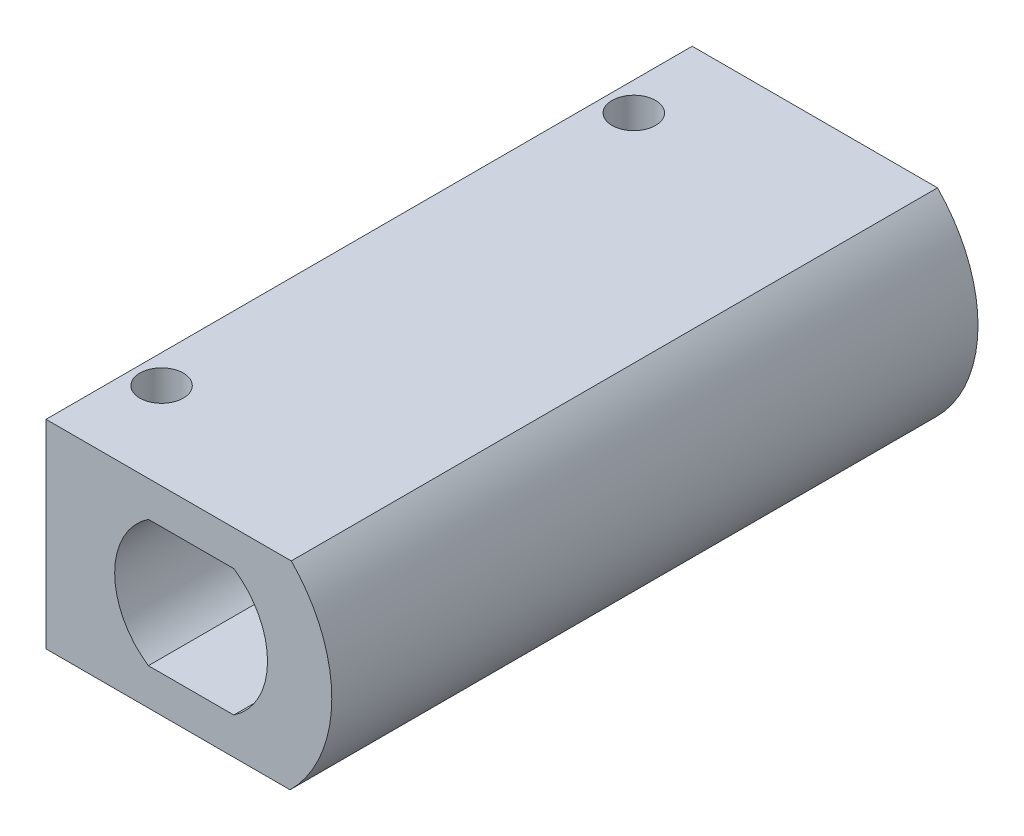
ISO-10303-21;
HEADER;
FILE_DESCRIPTION(('STEP AP214'),'2;1');
FILE_NAME('part.step','',(''),(''),'','','');
FILE_SCHEMA(('AUTOMOTIVE_DESIGN { 1 0 10303 214 1 1 1 1 }'));
ENDSEC;
DATA;
#1=APPLICATION_CONTEXT('core data for automotive mechanical design processes');
#2=APPLICATION_PROTOCOL_DEFINITION('international standard','automotive_design',2000,#1);
#3=PRODUCT_CONTEXT('',#1,'mechanical');
#4=PRODUCT('Part','Part','',(#3));
#5=PRODUCT_RELATED_PRODUCT_CATEGORY('part','',(#4));
#6=PRODUCT_DEFINITION_FORMATION('','',#4);
#7=PRODUCT_DEFINITION_CONTEXT('part definition',#1,'design');
#8=PRODUCT_DEFINITION('design','',#6,#7);
#9=PRODUCT_DEFINITION_SHAPE('','',#8);
#10=(LENGTH_UNIT() NAMED_UNIT(*) SI_UNIT(.MILLI.,.METRE.));
#11=(NAMED_UNIT(*) PLANE_ANGLE_UNIT() SI_UNIT($,.RADIAN.));
#12=(NAMED_UNIT(*) SI_UNIT($,.STERADIAN.) SOLID_ANGLE_UNIT());
#13=UNCERTAINTY_MEASURE_WITH_UNIT(LENGTH_MEASURE(1.E-05),#10,'distance_accuracy_value','');
#14=(GEOMETRIC_REPRESENTATION_CONTEXT(3) GLOBAL_UNCERTAINTY_ASSIGNED_CONTEXT((#13)) GLOBAL_UNIT_ASSIGNED_CONTEXT((#10,
#11,#12)) REPRESENTATION_CONTEXT('',''));
#15=CARTESIAN_POINT('',(0.,0.,0.));
#16=DIRECTION('',(0.,0.,1.));
#17=DIRECTION('',(1.,0.,0.));
#18=AXIS2_PLACEMENT_3D('',#15,#16,#17);
#19=CARTESIAN_POINT('',(0.,-0.291197411003233,52.));
#20=DIRECTION('',(0.,1.,0.));
#21=DIRECTION('',(-1.,0.,0.));
#22=AXIS2_PLACEMENT_3D('',#19,#20,#21);
#23=PLANE('',#22);
#24=CARTESIAN_POINT('',(-20.4679332061042,-0.291197411003231,7.));
#25=DIRECTION('',(0.,1.,0.));
#26=DIRECTION('',(-1.,0.,0.));
#27=AXIS2_PLACEMENT_3D('',#24,#25,#26);
#28=CIRCLE('',#27,1.75);
#29=CARTESIAN_POINT('',(-22.2179332061042,-0.291197411003232,7.));
#30=VERTEX_POINT('',#29);
#31=EDGE_CURVE('E277',#30,#30,#28,.T.);
#32=ORIENTED_EDGE('',*,*,#31,.T.);
#33=EDGE_LOOP('',(#32));
#34=FACE_BOUND('',#33,.T.);
#35=CARTESIAN_POINT('',(-20.4679332061042,-0.291197411003231,45.));
#36=DIRECTION('',(0.,1.,0.));
#37=DIRECTION('',(-1.,0.,0.));
#38=AXIS2_PLACEMENT_3D('',#35,#36,#37);
#39=CIRCLE('',#38,1.75);
#40=CARTESIAN_POINT('',(-22.2179332061042,-0.291197411003232,45.));
#41=VERTEX_POINT('',#40);
#42=EDGE_CURVE('E281',#41,#41,#39,.T.);
#43=ORIENTED_EDGE('',*,*,#42,.T.);
#44=EDGE_LOOP('',(#43));
#45=FACE_BOUND('',#44,.T.);
#46=DIRECTION('',(1.,0.,0.));
#47=VECTOR('',#46,1.);
#48=CARTESIAN_POINT('',(0.,-0.291197411003233,0.));
#49=LINE('',#48,#47);
#50=CARTESIAN_POINT('',(-22.7679332061042,-0.291197411003235,0.));
#51=VERTEX_POINT('',#50);
#52=CARTESIAN_POINT('',(-3.13212567747339,-0.291197411003234,0.));
#53=VERTEX_POINT('',#52);
#54=EDGE_CURVE('E285',#51,#53,#49,.T.);
#55=ORIENTED_EDGE('',*,*,#54,.T.);
#56=DIRECTION('',(0.,0.,-1.));
#57=VECTOR('',#56,1.);
#58=CARTESIAN_POINT('',(-3.13212567747339,-0.291197411003234,52.));
#59=LINE('',#58,#57);
#60=CARTESIAN_POINT('',(-3.13212567747339,-0.291197411003234,52.));
#61=VERTEX_POINT('',#60);
#62=EDGE_CURVE('E287',#61,#53,#59,.T.);
#63=ORIENTED_EDGE('',*,*,#62,.F.);
#64=DIRECTION('',(1.,0.,0.));
#65=VECTOR('',#64,1.);
#66=CARTESIAN_POINT('',(0.,-0.291197411003233,52.));
#67=LINE('',#66,#65);
#68=CARTESIAN_POINT('',(-22.7679332061042,-0.291197411003235,52.));
#69=VERTEX_POINT('',#68);
#70=EDGE_CURVE('E310',#69,#61,#67,.T.);
#71=ORIENTED_EDGE('',*,*,#70,.F.);
#72=DIRECTION('',(0.,0.,1.));
#73=VECTOR('',#72,1.);
#74=CARTESIAN_POINT('',(-22.7679332061042,-0.291197411003235,0.));
#75=LINE('',#74,#73);
#76=EDGE_CURVE('E289',#51,#69,#75,.T.);
#77=ORIENTED_EDGE('',*,*,#76,.F.);
#78=EDGE_LOOP('',(#55,#63,#71,#77));
#79=FACE_BOUND('',#78,.T.);
#80=ADVANCED_FACE('F47',(#34,#45,#79),#23,.F.);
#81=CARTESIAN_POINT('',(-11.0922513046228,7.75880258899676,52.));
#82=DIRECTION('',(0.,0.,-1.));
#83=DIRECTION('',(-1.,0.,0.));
#84=AXIS2_PLACEMENT_3D('',#81,#82,#83);
#85=CYLINDRICAL_SURFACE('',#84,11.32104677139);
#86=CARTESIAN_POINT('',(-11.0922513046228,7.75880258899676,0.));
#87=DIRECTION('',(0.,0.,1.));
#88=DIRECTION('',(1.,0.,0.));
#89=AXIS2_PLACEMENT_3D('',#86,#87,#88);
#90=CIRCLE('',#89,11.32104677139);
#91=CARTESIAN_POINT('',(-3.03225130462276,15.7088025889968,0.));
#92=VERTEX_POINT('',#91);
#93=EDGE_CURVE('E294',#53,#92,#90,.T.);
#94=ORIENTED_EDGE('',*,*,#93,.T.);
#95=DIRECTION('',(0.,0.,-1.));
#96=VECTOR('',#95,1.);
#97=CARTESIAN_POINT('',(-3.03225130462276,15.7088025889968,52.));
#98=LINE('',#97,#96);
#99=CARTESIAN_POINT('',(-3.03225130462276,15.7088025889968,52.));
#100=VERTEX_POINT('',#99);
#101=EDGE_CURVE('E311',#100,#92,#98,.T.);
#102=ORIENTED_EDGE('',*,*,#101,.F.);
#103=CARTESIAN_POINT('',(-11.0922513046228,7.75880258899676,52.));
#104=DIRECTION('',(0.,0.,1.));
#105=DIRECTION('',(1.,0.,0.));
#106=AXIS2_PLACEMENT_3D('',#103,#104,#105);
#107=CIRCLE('',#106,11.32104677139);
#108=EDGE_CURVE('E380',#61,#100,#107,.T.);
#109=ORIENTED_EDGE('',*,*,#108,.F.);
#110=ORIENTED_EDGE('',*,*,#62,.T.);
#111=EDGE_LOOP('',(#94,#102,#109,#110));
#112=FACE_BOUND('',#111,.T.);
#113=ADVANCED_FACE('F267',(#112),#85,.T.);
#114=CARTESIAN_POINT('',(0.,15.7088025889968,52.));
#115=DIRECTION('',(0.,1.,0.));
#116=DIRECTION('',(0.,0.,1.));
#117=AXIS2_PLACEMENT_3D('',#114,#115,#116);
#118=PLANE('',#117);
#119=CARTESIAN_POINT('',(-20.4679332061042,15.7088025889968,7.));
#120=DIRECTION('',(0.,1.,0.));
#121=DIRECTION('',(0.,0.,1.));
#122=AXIS2_PLACEMENT_3D('',#119,#120,#121);
#123=CIRCLE('',#122,1.75);
#124=CARTESIAN_POINT('',(-20.4679332061042,15.7088025889968,8.75));
#125=VERTEX_POINT('',#124);
#126=EDGE_CURVE('E356',#125,#125,#123,.T.);
#127=ORIENTED_EDGE('',*,*,#126,.F.);
#128=EDGE_LOOP('',(#127));
#129=FACE_BOUND('',#128,.T.);
#130=CARTESIAN_POINT('',(-20.4679332061042,15.7088025889968,45.));
#131=DIRECTION('',(0.,1.,0.));
#132=DIRECTION('',(0.,0.,1.));
#133=AXIS2_PLACEMENT_3D('',#130,#131,#132);
#134=CIRCLE('',#133,1.75);
#135=CARTESIAN_POINT('',(-20.4679332061042,15.7088025889968,46.75));
#136=VERTEX_POINT('',#135);
#137=EDGE_CURVE('E360',#136,#136,#134,.T.);
#138=ORIENTED_EDGE('',*,*,#137,.F.);
#139=EDGE_LOOP('',(#138));
#140=FACE_BOUND('',#139,.T.);
#141=DIRECTION('',(1.,0.,0.));
#142=VECTOR('',#141,1.);
#143=CARTESIAN_POINT('',(0.,15.7088025889968,0.));
#144=LINE('',#143,#142);
#145=CARTESIAN_POINT('',(-22.7679332061042,15.7088025889968,0.));
#146=VERTEX_POINT('',#145);
#147=EDGE_CURVE('E299',#146,#92,#144,.T.);
#148=ORIENTED_EDGE('',*,*,#147,.F.);
#149=DIRECTION('',(0.,0.,1.));
#150=VECTOR('',#149,1.);
#151=CARTESIAN_POINT('',(-22.7679332061042,15.7088025889968,0.));
#152=LINE('',#151,#150);
#153=CARTESIAN_POINT('',(-22.7679332061042,15.7088025889968,52.));
#154=VERTEX_POINT('',#153);
#155=EDGE_CURVE('E301',#146,#154,#152,.T.);
#156=ORIENTED_EDGE('',*,*,#155,.T.);
#157=DIRECTION('',(1.,0.,0.));
#158=VECTOR('',#157,1.);
#159=CARTESIAN_POINT('',(0.,15.7088025889968,52.));
#160=LINE('',#159,#158);
#161=EDGE_CURVE('E304',#154,#100,#160,.T.);
#162=ORIENTED_EDGE('',*,*,#161,.T.);
#163=ORIENTED_EDGE('',*,*,#101,.T.);
#164=EDGE_LOOP('',(#148,#156,#162,#163));
#165=FACE_BOUND('',#164,.T.);
#166=ADVANCED_FACE('F272',(#129,#140,#165),#118,.T.);
#167=CARTESIAN_POINT('',(0.,0.,52.));
#168=DIRECTION('',(0.,0.,1.));
#169=DIRECTION('',(1.,0.,0.));
#170=AXIS2_PLACEMENT_3D('',#167,#168,#169);
#171=PLANE('',#170);
#172=ORIENTED_EDGE('',*,*,#70,.T.);
#173=ORIENTED_EDGE('',*,*,#108,.T.);
#174=ORIENTED_EDGE('',*,*,#161,.F.);
#175=DIRECTION('',(0.,-1.,0.));
#176=VECTOR('',#175,1.);
#177=CARTESIAN_POINT('',(-22.7679332061042,15.7088025889968,52.));
#178=LINE('',#177,#176);
#179=EDGE_CURVE('E368',#154,#69,#178,.T.);
#180=ORIENTED_EDGE('',*,*,#179,.T.);
#181=EDGE_LOOP('',(#172,#173,#174,#180));
#182=FACE_BOUND('',#181,.T.);
#183=CARTESIAN_POINT('',(-11.0922513046228,7.75880258899676,52.));
#184=DIRECTION('',(0.,0.,1.));
#185=DIRECTION('',(1.,0.,0.));
#186=AXIS2_PLACEMENT_3D('',#183,#184,#185);
#187=CIRCLE('',#186,6.15);
#188=CARTESIAN_POINT('',(-7.65531953340588,2.65880258899676,52.));
#189=VERTEX_POINT('',#188);
#190=CARTESIAN_POINT('',(-7.65531953340588,12.8588025889968,52.));
#191=VERTEX_POINT('',#190);
#192=EDGE_CURVE('E167',#189,#191,#187,.T.);
#193=ORIENTED_EDGE('',*,*,#192,.F.);
#194=DIRECTION('',(-1.,0.,0.));
#195=VECTOR('',#194,1.);
#196=CARTESIAN_POINT('',(0.,2.65880258899677,52.));
#197=LINE('',#196,#195);
#198=CARTESIAN_POINT('',(-14.5291830758397,2.65880258899676,52.));
#199=VERTEX_POINT('',#198);
#200=EDGE_CURVE('E191',#189,#199,#197,.T.);
#201=ORIENTED_EDGE('',*,*,#200,.T.);
#202=CARTESIAN_POINT('',(-11.0922513046228,7.75880258899676,52.));
#203=DIRECTION('',(0.,0.,1.));
#204=DIRECTION('',(1.,0.,0.));
#205=AXIS2_PLACEMENT_3D('',#202,#203,#204);
#206=CIRCLE('',#205,6.15);
#207=CARTESIAN_POINT('',(-14.5291830758396,12.8588025889968,52.));
#208=VERTEX_POINT('',#207);
#209=EDGE_CURVE('E195',#208,#199,#206,.T.);
#210=ORIENTED_EDGE('',*,*,#209,.F.);
#211=DIRECTION('',(-1.,0.,0.));
#212=VECTOR('',#211,1.);
#213=CARTESIAN_POINT('',(0.,12.8588025889968,52.));
#214=LINE('',#213,#212);
#215=EDGE_CURVE('E177',#191,#208,#214,.T.);
#216=ORIENTED_EDGE('',*,*,#215,.F.);
#217=EDGE_LOOP('',(#193,#201,#210,#216));
#218=FACE_BOUND('',#217,.T.);
#219=ADVANCED_FACE('F332',(#182,#218),#171,.T.);
#220=CARTESIAN_POINT('',(0.,0.,0.));
#221=DIRECTION('',(0.,0.,1.));
#222=DIRECTION('',(1.,0.,0.));
#223=AXIS2_PLACEMENT_3D('',#220,#221,#222);
#224=PLANE('',#223);
#225=ORIENTED_EDGE('',*,*,#54,.F.);
#226=DIRECTION('',(0.,-1.,0.));
#227=VECTOR('',#226,1.);
#228=CARTESIAN_POINT('',(-22.7679332061042,15.7088025889968,0.));
#229=LINE('',#228,#227);
#230=EDGE_CURVE('E366',#146,#51,#229,.T.);
#231=ORIENTED_EDGE('',*,*,#230,.F.);
#232=ORIENTED_EDGE('',*,*,#147,.T.);
#233=ORIENTED_EDGE('',*,*,#93,.F.);
#234=EDGE_LOOP('',(#225,#231,#232,#233));
#235=FACE_BOUND('',#234,.T.);
#236=CARTESIAN_POINT('',(-11.0922513046228,7.75880258899676,0.));
#237=DIRECTION('',(0.,0.,1.));
#238=DIRECTION('',(1.,0.,0.));
#239=AXIS2_PLACEMENT_3D('',#236,#237,#238);
#240=CIRCLE('',#239,6.15);
#241=CARTESIAN_POINT('',(-7.65531953340588,2.65880258899676,0.));
#242=VERTEX_POINT('',#241);
#243=CARTESIAN_POINT('',(-7.65531953340588,12.8588025889968,0.));
#244=VERTEX_POINT('',#243);
#245=EDGE_CURVE('E172',#242,#244,#240,.T.);
#246=ORIENTED_EDGE('',*,*,#245,.T.);
#247=DIRECTION('',(-1.,0.,0.));
#248=VECTOR('',#247,1.);
#249=CARTESIAN_POINT('',(0.,12.8588025889968,0.));
#250=LINE('',#249,#248);
#251=CARTESIAN_POINT('',(-14.5291830758396,12.8588025889968,0.));
#252=VERTEX_POINT('',#251);
#253=EDGE_CURVE('E184',#244,#252,#250,.T.);
#254=ORIENTED_EDGE('',*,*,#253,.T.);
#255=CARTESIAN_POINT('',(-11.0922513046228,7.75880258899676,0.));
#256=DIRECTION('',(0.,0.,1.));
#257=DIRECTION('',(1.,0.,0.));
#258=AXIS2_PLACEMENT_3D('',#255,#256,#257);
#259=CIRCLE('',#258,6.15);
#260=CARTESIAN_POINT('',(-14.5291830758397,2.65880258899676,0.));
#261=VERTEX_POINT('',#260);
#262=EDGE_CURVE('E181',#252,#261,#259,.T.);
#263=ORIENTED_EDGE('',*,*,#262,.T.);
#264=DIRECTION('',(-1.,0.,0.));
#265=VECTOR('',#264,1.);
#266=CARTESIAN_POINT('',(0.,2.65880258899677,0.));
#267=LINE('',#266,#265);
#268=EDGE_CURVE('E176',#242,#261,#267,.T.);
#269=ORIENTED_EDGE('',*,*,#268,.F.);
#270=EDGE_LOOP('',(#246,#254,#263,#269));
#271=FACE_BOUND('',#270,.T.);
#272=ADVANCED_FACE('F336',(#235,#271),#224,.F.);
#273=CARTESIAN_POINT('',(-22.7679332061042,15.7088025889968,0.));
#274=DIRECTION('',(-1.,0.,0.));
#275=DIRECTION('',(0.,0.,1.));
#276=AXIS2_PLACEMENT_3D('',#273,#274,#275);
#277=PLANE('',#276);
#278=DIRECTION('',(0.,-1.,0.));
#279=VECTOR('',#278,1.);
#280=CARTESIAN_POINT('',(-22.7679332061042,3.7558231890946,22.5544976852205));
#281=LINE('',#280,#279);
#282=CARTESIAN_POINT('',(-22.7679332061042,11.6617819888989,22.5544976852205));
#283=VERTEX_POINT('',#282);
#284=CARTESIAN_POINT('',(-22.7679332061042,3.7558231890946,22.5544976852205));
#285=VERTEX_POINT('',#284);
#286=EDGE_CURVE('E62',#283,#285,#281,.T.);
#287=ORIENTED_EDGE('',*,*,#286,.F.);
#288=DIRECTION('',(0.,0.,-1.));
#289=VECTOR('',#288,1.);
#290=CARTESIAN_POINT('',(-22.7679332061042,11.6617819888989,29.4455023147795));
#291=LINE('',#290,#289);
#292=CARTESIAN_POINT('',(-22.7679332061042,11.6617819888989,29.4455023147795));
#293=VERTEX_POINT('',#292);
#294=EDGE_CURVE('E157',#293,#283,#291,.T.);
#295=ORIENTED_EDGE('',*,*,#294,.F.);
#296=DIRECTION('',(0.,1.,0.));
#297=VECTOR('',#296,1.);
#298=CARTESIAN_POINT('',(-22.7679332061042,3.7558231890946,29.4455023147795));
#299=LINE('',#298,#297);
#300=CARTESIAN_POINT('',(-22.7679332061042,3.7558231890946,29.4455023147795));
#301=VERTEX_POINT('',#300);
#302=EDGE_CURVE('E139',#301,#293,#299,.T.);
#303=ORIENTED_EDGE('',*,*,#302,.F.);
#304=DIRECTION('',(0.,0.,1.));
#305=VECTOR('',#304,1.);
#306=CARTESIAN_POINT('',(-22.7679332061042,3.7558231890946,29.4455023147795));
#307=LINE('',#306,#305);
#308=EDGE_CURVE('E149',#285,#301,#307,.T.);
#309=ORIENTED_EDGE('',*,*,#308,.F.);
#310=EDGE_LOOP('',(#287,#295,#303,#309));
#311=FACE_BOUND('',#310,.T.);
#312=ORIENTED_EDGE('',*,*,#179,.F.);
#313=ORIENTED_EDGE('',*,*,#155,.F.);
#314=ORIENTED_EDGE('',*,*,#230,.T.);
#315=ORIENTED_EDGE('',*,*,#76,.T.);
#316=EDGE_LOOP('',(#312,#313,#314,#315));
#317=FACE_BOUND('',#316,.T.);
#318=ADVANCED_FACE('F154',(#311,#317),#277,.T.);
#319=CARTESIAN_POINT('',(-20.4679332061042,-36.2911974110032,45.));
#320=DIRECTION('',(0.,1.,0.));
#321=DIRECTION('',(0.,0.,1.));
#322=AXIS2_PLACEMENT_3D('',#319,#320,#321);
#323=CYLINDRICAL_SURFACE('',#322,1.75);
#324=ORIENTED_EDGE('',*,*,#137,.T.);
#325=EDGE_LOOP('',(#324));
#326=FACE_BOUND('',#325,.T.);
#327=CARTESIAN_POINT('',(-18.7179332061042,7.14931465850208,45.));
#328=CARTESIAN_POINT('',(-18.7179333370688,7.14931606310764,45.0087552454944));
#329=CARTESIAN_POINT('',(-18.717999828755,7.15014645955571,45.0175198599463));
#330=CARTESIAN_POINT('',(-18.718257010992,7.15337762559734,45.0347567345843));
#331=CARTESIAN_POINT('',(-18.7184479348918,7.15578134569793,45.04322841393));
#332=CARTESIAN_POINT('',(-18.7189289256917,7.16189588581688,45.059586273598));
#333=CARTESIAN_POINT('',(-18.7192180908481,7.16559482632899,45.0674770118114));
#334=CARTESIAN_POINT('',(-18.7198701045285,7.1740381127141,45.0826632639319));
#335=CARTESIAN_POINT('',(-18.7202329664593,7.17878264881512,45.0899586691971));
#336=CARTESIAN_POINT('',(-18.7213052329645,7.19301299878081,45.1092887710144));
#337=CARTESIAN_POINT('',(-18.7220677109058,7.20335317963089,45.1206895589486));
#338=CARTESIAN_POINT('',(-18.72365660195,7.22562344484626,45.1418140114438));
#339=CARTESIAN_POINT('',(-18.7244832333031,7.23755906610736,45.1515315518106));
#340=CARTESIAN_POINT('',(-18.726839392747,7.27291612849566,45.1771267140541));
#341=CARTESIAN_POINT('',(-18.7283752551929,7.2975535423159,45.1913098418568));
#342=CARTESIAN_POINT('',(-18.7312852924819,7.34852997116798,45.2161122485478));
#343=CARTESIAN_POINT('',(-18.7326590594361,7.37487303091432,45.2267226564376));
#344=CARTESIAN_POINT('',(-18.7363459494419,7.45381562110562,45.2538628141434));
#345=CARTESIAN_POINT('',(-18.7383234608581,7.50775225038189,45.2665408850413));
#346=CARTESIAN_POINT('',(-18.7411317161989,7.61688207111154,45.2841144531732));
#347=CARTESIAN_POINT('',(-18.7419596642974,7.67207799537406,45.2889909808207));
#348=CARTESIAN_POINT('',(-18.7424331005185,7.78736352953657,45.2918101193889));
#349=CARTESIAN_POINT('',(-18.7419717759113,7.84746921752409,45.2891262271061));
#350=CARTESIAN_POINT('',(-18.7396565528809,7.96669082821864,45.2750007333729));
#351=CARTESIAN_POINT('',(-18.7378043711267,8.02580787927858,45.2635699274924));
#352=CARTESIAN_POINT('',(-18.7340792240742,8.11363792783833,45.2373325512554));
#353=CARTESIAN_POINT('',(-18.7326241771254,8.14359610265557,45.2266296644637));
#354=CARTESIAN_POINT('',(-18.7294772833874,8.20164034942622,45.2011050397982));
#355=CARTESIAN_POINT('',(-18.7277868150941,8.22973600684146,45.1863068167814));
#356=CARTESIAN_POINT('',(-18.7254062991563,8.26630246761637,45.1616995792335));
#357=CARTESIAN_POINT('',(-18.7247288091747,8.27637553773341,45.1542769713408));
#358=CARTESIAN_POINT('',(-18.7233941253219,8.29569375244904,45.1383754431147));
#359=CARTESIAN_POINT('',(-18.7227369625045,8.30493766767737,45.1298949974404));
#360=CARTESIAN_POINT('',(-18.7214735278507,8.32231402879842,45.111639549224));
#361=CARTESIAN_POINT('',(-18.7208679697689,8.3304316373635,45.1018500955015));
#362=CARTESIAN_POINT('',(-18.7197770883206,8.34480801677038,45.0809823223134));
#363=CARTESIAN_POINT('',(-18.7192913517063,8.35107319168519,45.069908631977));
#364=CARTESIAN_POINT('',(-18.7186502099865,8.35926115124763,45.0506649511928));
#365=CARTESIAN_POINT('',(-18.7184386634161,8.36193636309496,45.0428181874785));
#366=CARTESIAN_POINT('',(-18.7181199521093,8.365952906487,45.0267874491239));
#367=CARTESIAN_POINT('',(-18.7180126829013,8.36729557308787,45.0186038205643));
#368=CARTESIAN_POINT('',(-18.7179149373757,8.36851941169658,45.0020952919868));
#369=CARTESIAN_POINT('',(-18.7179248826883,8.36839530760643,44.9937699896016));
#370=CARTESIAN_POINT('',(-18.7180613337604,8.36668585898878,44.9772711522677));
#371=CARTESIAN_POINT('',(-18.718187898434,8.36509977589337,44.9690976961584));
#372=CARTESIAN_POINT('',(-18.7185360350328,8.36070434947062,44.9534297934088));
#373=CARTESIAN_POINT('',(-18.7187538451309,8.35794337950196,44.9459213648619));
#374=CARTESIAN_POINT('',(-18.7192643638869,8.35140919099685,44.9313678064093));
#375=CARTESIAN_POINT('',(-18.719557098583,8.34763562053502,44.9243228386396));
#376=CARTESIAN_POINT('',(-18.7204168903814,8.33641741332647,44.9060952256656));
#377=CARTESIAN_POINT('',(-18.72103470088,8.32822637356913,44.895375186845));
#378=CARTESIAN_POINT('',(-18.7223516058955,8.31030177788291,44.8753156027228));
#379=CARTESIAN_POINT('',(-18.7230509657637,8.30056314677423,44.8659808020625));
#380=CARTESIAN_POINT('',(-18.7250250275279,8.27221301284853,44.8418459431979));
#381=CARTESIAN_POINT('',(-18.726330273546,8.25251682686539,44.8283334395702));
#382=CARTESIAN_POINT('',(-18.7288766903172,8.21144375403806,44.804229779037));
#383=CARTESIAN_POINT('',(-18.7301177039149,8.19006304056739,44.7936455351436));
#384=CARTESIAN_POINT('',(-18.7335965373046,8.12511682153981,44.7656104778769));
#385=CARTESIAN_POINT('',(-18.7356349629301,8.08013040066895,44.7514444997314));
#386=CARTESIAN_POINT('',(-18.738938087024,7.98860643849929,44.7294715312735));
#387=CARTESIAN_POINT('',(-18.7402001431014,7.94206416217332,44.721686228188));
#388=CARTESIAN_POINT('',(-18.742267170961,7.82606668976959,44.7090625102714));
#389=CARTESIAN_POINT('',(-18.7425685353217,7.75625138622444,44.7073912996975));
#390=CARTESIAN_POINT('',(-18.7412555323529,7.61726008288846,44.7151975723798));
#391=CARTESIAN_POINT('',(-18.739644278344,7.54808322835844,44.7246569372979));
#392=CARTESIAN_POINT('',(-18.7360187315725,7.44835292358583,44.7489508576555));
#393=CARTESIAN_POINT('',(-18.7346520061865,7.41645771121098,44.7584156421452));
#394=CARTESIAN_POINT('',(-18.7316063274005,7.354192244739,44.7813455927329));
#395=CARTESIAN_POINT('',(-18.7299286733656,7.32381628910277,44.7947942453745));
#396=CARTESIAN_POINT('',(-18.7273670199213,7.28163436911556,44.8183878175551));
#397=CARTESIAN_POINT('',(-18.7265423306182,7.26863978998341,44.8264096843655));
#398=CARTESIAN_POINT('',(-18.7248920320858,7.24358245905008,44.8438429979383));
#399=CARTESIAN_POINT('',(-18.7240664226007,7.23152020233076,44.8532551753657));
#400=CARTESIAN_POINT('',(-18.7225850911385,7.2105323093934,44.8721874117659));
#401=CARTESIAN_POINT('',(-18.7219223777722,7.20140706580602,44.8814827240026));
#402=CARTESIAN_POINT('',(-18.720684836045,7.18471948650703,44.9013993886226));
#403=CARTESIAN_POINT('',(-18.7201098024279,7.17715348556813,44.912017534907));
#404=CARTESIAN_POINT('',(-18.7192816953473,7.16641204668384,44.9308938875809));
#405=CARTESIAN_POINT('',(-18.7189847939644,7.16260956247553,44.9387913638068));
#406=CARTESIAN_POINT('',(-18.7184906578681,7.15632157041812,44.955092231894));
#407=CARTESIAN_POINT('',(-18.7182931757195,7.15383279225016,44.9634943089162));
#408=CARTESIAN_POINT('',(-18.7180829817812,7.15119084244235,44.9766445289061));
#409=CARTESIAN_POINT('',(-18.7180270567695,7.15048982439447,44.9812861361925));
#410=CARTESIAN_POINT('',(-18.7179521287681,7.14955129241043,44.9906175899418));
#411=CARTESIAN_POINT('',(-18.717933135911,7.14931390567535,44.9953074492885));
#412=CARTESIAN_POINT('',(-18.7179332061042,7.14931465850208,45.));
#413=B_SPLINE_CURVE_WITH_KNOTS('',3,(#327,#328,#329,#330,#331,#332,#333,#334,#335,#336,#337,
#338,#339,#340,#341,#342,#343,#344,#345,#346,#347,#348,#349,#350,#351,#352,#353,#354,#355,#356,
#357,#358,#359,#360,#361,#362,#363,#364,#365,#366,#367,#368,#369,#370,#371,#372,#373,#374,#375,
#376,#377,#378,#379,#380,#381,#382,#383,#384,#385,#386,#387,#388,#389,#390,#391,#392,#393,#394,
#395,#396,#397,#398,#399,#400,#401,#402,#403,#404,#405,#406,#407,#408,#409,#410,#411,#412),
.UNSPECIFIED.,.T.,.F.,(4,2,2,2,2,2,2,2,2,2,2,2,2,2,2,2,2,2,2,2,2,2,2,2,2,2,2,2,2,2,2,2,2,2,2,2,
2,2,2,2,2,2,4),(0.,0.0262451461540856,0.0525396522812281,0.0785990481482887,0.104663188991323,
0.150625796697915,0.196752270361341,0.281680576341086,0.366818228981798,0.532230559903927,
0.698044485778471,0.877992902879608,1.05771958249736,1.15307647463526,1.24789681164493,
1.28543639504747,1.32303074802603,1.36108098212858,1.39899809147534,1.42377830107328,
1.44853365862994,1.47337809031815,1.49823507989011,1.5221549209002,1.54608308594947,
1.58636395365702,1.62677975346019,1.69813891654919,1.76966513352377,1.91050208312838,
2.0518157600533,2.26040187660742,2.46864892609269,2.56837688057953,2.66769710503944,
2.71351347289881,2.75935400536155,2.79836882251287,2.83729085640683,2.86351053064187,
2.88966462249188,2.90372738113084,2.91779399746239),.UNSPECIFIED.);
#414=CARTESIAN_POINT('',(-18.7179332061042,7.14931465850208,45.));
#415=VERTEX_POINT('',#414);
#416=EDGE_CURVE('E223',#415,#415,#413,.T.);
#417=ORIENTED_EDGE('',*,*,#416,.F.);
#418=EDGE_LOOP('',(#417));
#419=FACE_BOUND('',#418,.T.);
#420=ORIENTED_EDGE('',*,*,#42,.F.);
#421=EDGE_LOOP('',(#420));
#422=FACE_BOUND('',#421,.T.);
#423=ADVANCED_FACE('F344',(#326,#419,#422),#323,.F.);
#424=CARTESIAN_POINT('',(-20.4679332061042,-36.2911974110032,7.));
#425=DIRECTION('',(0.,1.,0.));
#426=DIRECTION('',(0.,0.,1.));
#427=AXIS2_PLACEMENT_3D('',#424,#425,#426);
#428=CYLINDRICAL_SURFACE('',#427,1.75);
#429=ORIENTED_EDGE('',*,*,#126,.T.);
#430=EDGE_LOOP('',(#429));
#431=FACE_BOUND('',#430,.T.);
#432=CARTESIAN_POINT('',(-18.7179332061042,7.14931465850208,7.));
#433=CARTESIAN_POINT('',(-18.7179333370688,7.14931606310765,7.00875524549438));
#434=CARTESIAN_POINT('',(-18.717999828755,7.15014645955572,7.01751985994632));
#435=CARTESIAN_POINT('',(-18.718257010992,7.15337762559735,7.03475673458433));
#436=CARTESIAN_POINT('',(-18.7184479348918,7.15578134569794,7.04322841393));
#437=CARTESIAN_POINT('',(-18.7189289256917,7.16189588581689,7.059586273598));
#438=CARTESIAN_POINT('',(-18.7192180908481,7.165594826329,7.06747701181141));
#439=CARTESIAN_POINT('',(-18.7198701045285,7.17403811271411,7.0826632639319));
#440=CARTESIAN_POINT('',(-18.7202329664593,7.17878264881512,7.08995866919707));
#441=CARTESIAN_POINT('',(-18.7213052329645,7.1930129987808,7.1092887710144));
#442=CARTESIAN_POINT('',(-18.7220677109058,7.20335317963089,7.12068955894857));
#443=CARTESIAN_POINT('',(-18.72365660195,7.22562344484626,7.14181401144379));
#444=CARTESIAN_POINT('',(-18.7244832333031,7.23755906610736,7.15153155181056));
#445=CARTESIAN_POINT('',(-18.726839392747,7.27291612849566,7.17712671405412));
#446=CARTESIAN_POINT('',(-18.7283752551929,7.29755354231591,7.19130984185683));
#447=CARTESIAN_POINT('',(-18.7312852924819,7.34852997116799,7.21611224854778));
#448=CARTESIAN_POINT('',(-18.7326590594361,7.37487303091434,7.2267226564376));
#449=CARTESIAN_POINT('',(-18.7363459494419,7.45381562110564,7.25386281414338));
#450=CARTESIAN_POINT('',(-18.7383234608581,7.50775225038191,7.26654088504126));
#451=CARTESIAN_POINT('',(-18.7411317161989,7.61688207111156,7.28411445317321));
#452=CARTESIAN_POINT('',(-18.7419596642974,7.67207799537408,7.28899098082069));
#453=CARTESIAN_POINT('',(-18.7424331005185,7.78736352953659,7.29181011938892));
#454=CARTESIAN_POINT('',(-18.7419717759113,7.84746921752411,7.28912622710611));
#455=CARTESIAN_POINT('',(-18.7396565528809,7.96669082821867,7.27500073337291));
#456=CARTESIAN_POINT('',(-18.7378043711267,8.0258078792786,7.26356992749242));
#457=CARTESIAN_POINT('',(-18.7340792240742,8.11363792783835,7.23733255125536));
#458=CARTESIAN_POINT('',(-18.7326241771254,8.14359610265559,7.22662966446371));
#459=CARTESIAN_POINT('',(-18.7294772833874,8.20164034942623,7.20110503979818));
#460=CARTESIAN_POINT('',(-18.7277868150941,8.22973600684148,7.18630681678137));
#461=CARTESIAN_POINT('',(-18.7254062991563,8.26630246761638,7.1616995792335));
#462=CARTESIAN_POINT('',(-18.7247288091747,8.27637553773342,7.15427697134079));
#463=CARTESIAN_POINT('',(-18.7233941253219,8.29569375244904,7.13837544311465));
#464=CARTESIAN_POINT('',(-18.7227369625045,8.30493766767738,7.12989499744037));
#465=CARTESIAN_POINT('',(-18.7214735278507,8.32231402879843,7.11163954922402));
#466=CARTESIAN_POINT('',(-18.7208679697689,8.33043163736351,7.10185009550148));
#467=CARTESIAN_POINT('',(-18.7197770883206,8.34480801677038,7.08098232231334));
#468=CARTESIAN_POINT('',(-18.7192913517063,8.35107319168519,7.06990863197703));
#469=CARTESIAN_POINT('',(-18.7186502099865,8.35926115124763,7.05066495119277));
#470=CARTESIAN_POINT('',(-18.7184386634161,8.36193636309496,7.04281818747847));
#471=CARTESIAN_POINT('',(-18.7181199521093,8.365952906487,7.02678744912387));
#472=CARTESIAN_POINT('',(-18.7180126829013,8.36729557308786,7.01860382056432));
#473=CARTESIAN_POINT('',(-18.7179149373757,8.36851941169657,7.00209529198679));
#474=CARTESIAN_POINT('',(-18.7179248826883,8.36839530760643,6.99376998960163));
#475=CARTESIAN_POINT('',(-18.7180613337604,8.36668585898878,6.97727115226767));
#476=CARTESIAN_POINT('',(-18.718187898434,8.36509977589336,6.96909769615837));
#477=CARTESIAN_POINT('',(-18.7185360350328,8.36070434947061,6.95342979340882));
#478=CARTESIAN_POINT('',(-18.7187538451309,8.35794337950195,6.94592136486194));
#479=CARTESIAN_POINT('',(-18.7192643638869,8.35140919099684,6.93136780640935));
#480=CARTESIAN_POINT('',(-18.719557098583,8.34763562053502,6.92432283863958));
#481=CARTESIAN_POINT('',(-18.7204168903814,8.33641741332648,6.90609522566561));
#482=CARTESIAN_POINT('',(-18.72103470088,8.32822637356913,6.89537518684497));
#483=CARTESIAN_POINT('',(-18.7223516058955,8.31030177788291,6.87531560272277));
#484=CARTESIAN_POINT('',(-18.7230509657637,8.30056314677422,6.86598080206246));
#485=CARTESIAN_POINT('',(-18.7250250275279,8.27221301284853,6.84184594319786));
#486=CARTESIAN_POINT('',(-18.726330273546,8.25251682686539,6.82833343957022));
#487=CARTESIAN_POINT('',(-18.7288766903172,8.21144375403807,6.80422977903701));
#488=CARTESIAN_POINT('',(-18.7301177039149,8.1900630405674,6.79364553514363));
#489=CARTESIAN_POINT('',(-18.7335965373046,8.12511682153981,6.7656104778769));
#490=CARTESIAN_POINT('',(-18.7356349629301,8.08013040066896,6.75144449973144));
#491=CARTESIAN_POINT('',(-18.738938087024,7.98860643849931,6.72947153127344));
#492=CARTESIAN_POINT('',(-18.7402001431014,7.94206416217333,6.72168622818797));
#493=CARTESIAN_POINT('',(-18.742267170961,7.8260666897696,6.70906251027143));
#494=CARTESIAN_POINT('',(-18.7425685353217,7.75625138622445,6.70739129969746));
#495=CARTESIAN_POINT('',(-18.7412555323529,7.61726008288847,6.71519757237982));
#496=CARTESIAN_POINT('',(-18.739644278344,7.54808322835845,6.7246569372979));
#497=CARTESIAN_POINT('',(-18.7360187315725,7.44835292358584,6.74895085765553));
#498=CARTESIAN_POINT('',(-18.7346520061865,7.41645771121099,6.75841564214518));
#499=CARTESIAN_POINT('',(-18.7316063274005,7.35419224473901,6.78134559273292));
#500=CARTESIAN_POINT('',(-18.7299286733656,7.32381628910278,6.7947942453745));
#501=CARTESIAN_POINT('',(-18.7273670199213,7.28163436911557,6.81838781755514));
#502=CARTESIAN_POINT('',(-18.7265423306182,7.26863978998343,6.82640968436546));
#503=CARTESIAN_POINT('',(-18.7248920320858,7.24358245905009,6.8438429979383));
#504=CARTESIAN_POINT('',(-18.7240664226007,7.23152020233078,6.85325517536567));
#505=CARTESIAN_POINT('',(-18.7225850911385,7.2105323093934,6.87218741176588));
#506=CARTESIAN_POINT('',(-18.7219223777722,7.20140706580603,6.88148272400258));
#507=CARTESIAN_POINT('',(-18.720684836045,7.18471948650704,6.90139938862257));
#508=CARTESIAN_POINT('',(-18.7201098024279,7.17715348556814,6.91201753490698));
#509=CARTESIAN_POINT('',(-18.7192816953473,7.16641204668385,6.93089388758087));
#510=CARTESIAN_POINT('',(-18.7189847939644,7.16260956247554,6.93879136380684));
#511=CARTESIAN_POINT('',(-18.7184906578682,7.15632157041813,6.95509223189398));
#512=CARTESIAN_POINT('',(-18.7182931757195,7.15383279225017,6.96349430891623));
#513=CARTESIAN_POINT('',(-18.7180829817812,7.15119084244235,6.97664452890613));
#514=CARTESIAN_POINT('',(-18.7180270567695,7.15048982439447,6.98128613619248));
#515=CARTESIAN_POINT('',(-18.7179521287681,7.14955129241042,6.99061758994184));
#516=CARTESIAN_POINT('',(-18.717933135911,7.14931390567535,6.99530744928853));
#517=CARTESIAN_POINT('',(-18.7179332061042,7.14931465850208,7.));
#518=B_SPLINE_CURVE_WITH_KNOTS('',3,(#432,#433,#434,#435,#436,#437,#438,#439,#440,#441,#442,
#443,#444,#445,#446,#447,#448,#449,#450,#451,#452,#453,#454,#455,#456,#457,#458,#459,#460,#461,
#462,#463,#464,#465,#466,#467,#468,#469,#470,#471,#472,#473,#474,#475,#476,#477,#478,#479,#480,
#481,#482,#483,#484,#485,#486,#487,#488,#489,#490,#491,#492,#493,#494,#495,#496,#497,#498,#499,
#500,#501,#502,#503,#504,#505,#506,#507,#508,#509,#510,#511,#512,#513,#514,#515,#516,#517),
.UNSPECIFIED.,.T.,.F.,(4,2,2,2,2,2,2,2,2,2,2,2,2,2,2,2,2,2,2,2,2,2,2,2,2,2,2,2,2,2,2,2,2,2,2,2,
2,2,2,2,2,2,4),(0.,0.026245146154094,0.0525396522812301,0.0785990481482917,0.104663188991323,
0.150625796697915,0.196752270361342,0.281680576341092,0.366818228981809,0.532230559903942,
0.698044485778491,0.877992902879628,1.05771958249738,1.15307647463528,1.24789681164494,
1.28543639504748,1.32303074802603,1.36108098212859,1.39899809147533,1.42377830107328,
1.44853365862993,1.47337809031814,1.4982350798901,1.52215492090018,1.54608308594945,
1.58636395365701,1.62677975346018,1.69813891654917,1.76966513352375,1.91050208312836,
2.05181576005327,2.26040187660739,2.46864892609266,2.56837688057951,2.66769710503941,
2.71351347289878,2.75935400536153,2.79836882251285,2.83729085640681,2.86351053064184,
2.88966462249185,2.90372738113081,2.91779399746237),.UNSPECIFIED.);
#519=CARTESIAN_POINT('',(-18.7179332061042,7.14931465850208,7.));
#520=VERTEX_POINT('',#519);
#521=EDGE_CURVE('E205',#520,#520,#518,.T.);
#522=ORIENTED_EDGE('',*,*,#521,.F.);
#523=EDGE_LOOP('',(#522));
#524=FACE_BOUND('',#523,.T.);
#525=ORIENTED_EDGE('',*,*,#31,.F.);
#526=EDGE_LOOP('',(#525));
#527=FACE_BOUND('',#526,.T.);
#528=ADVANCED_FACE('F229',(#431,#524,#527),#428,.F.);
#529=CARTESIAN_POINT('',(-11.0922513046228,7.75880258899676,0.));
#530=DIRECTION('',(0.,0.,1.));
#531=DIRECTION('',(1.,0.,0.));
#532=AXIS2_PLACEMENT_3D('',#529,#530,#531);
#533=CYLINDRICAL_SURFACE('',#532,7.65);
#534=ORIENTED_EDGE('',*,*,#521,.T.);
#535=EDGE_LOOP('',(#534));
#536=FACE_BOUND('',#535,.T.);
#537=ADVANCED_FACE('F236',(#536),#533,.T.);
#538=ORIENTED_EDGE('',*,*,#416,.T.);
#539=EDGE_LOOP('',(#538));
#540=FACE_BOUND('',#539,.T.);
#541=ADVANCED_FACE('F231',(#540),#533,.T.);
#542=CARTESIAN_POINT('',(-11.0922513046228,7.75880258899676,0.));
#543=DIRECTION('',(0.,0.,1.));
#544=DIRECTION('',(1.,0.,0.));
#545=AXIS2_PLACEMENT_3D('',#542,#543,#544);
#546=CYLINDRICAL_SURFACE('',#545,6.15);
#547=ORIENTED_EDGE('',*,*,#192,.T.);
#548=DIRECTION('',(0.,0.,1.));
#549=VECTOR('',#548,1.);
#550=CARTESIAN_POINT('',(-7.65531953340588,12.8588025889968,0.));
#551=LINE('',#550,#549);
#552=EDGE_CURVE('E201',#244,#191,#551,.T.);
#553=ORIENTED_EDGE('',*,*,#552,.F.);
#554=ORIENTED_EDGE('',*,*,#245,.F.);
#555=DIRECTION('',(0.,0.,1.));
#556=VECTOR('',#555,1.);
#557=CARTESIAN_POINT('',(-7.65531953340588,2.65880258899676,0.));
#558=LINE('',#557,#556);
#559=EDGE_CURVE('E187',#242,#189,#558,.T.);
#560=ORIENTED_EDGE('',*,*,#559,.T.);
#561=EDGE_LOOP('',(#547,#553,#554,#560));
#562=FACE_BOUND('',#561,.T.);
#563=ADVANCED_FACE('F235',(#562),#546,.F.);
#564=CARTESIAN_POINT('',(0.,12.8588025889968,0.));
#565=DIRECTION('',(0.,1.,0.));
#566=DIRECTION('',(0.,0.,1.));
#567=AXIS2_PLACEMENT_3D('',#564,#565,#566);
#568=PLANE('',#567);
#569=ORIENTED_EDGE('',*,*,#215,.T.);
#570=DIRECTION('',(0.,0.,1.));
#571=VECTOR('',#570,1.);
#572=CARTESIAN_POINT('',(-14.5291830758396,12.8588025889968,0.));
#573=LINE('',#572,#571);
#574=EDGE_CURVE('E206',#252,#208,#573,.T.);
#575=ORIENTED_EDGE('',*,*,#574,.F.);
#576=ORIENTED_EDGE('',*,*,#253,.F.);
#577=ORIENTED_EDGE('',*,*,#552,.T.);
#578=EDGE_LOOP('',(#569,#575,#576,#577));
#579=FACE_BOUND('',#578,.T.);
#580=ADVANCED_FACE('F241',(#579),#568,.F.);
#581=CARTESIAN_POINT('',(-11.0922513046228,7.75880258899676,0.));
#582=DIRECTION('',(0.,0.,1.));
#583=DIRECTION('',(1.,0.,0.));
#584=AXIS2_PLACEMENT_3D('',#581,#582,#583);
#585=CYLINDRICAL_SURFACE('',#584,6.15);
#586=DIRECTION('',(0.,0.,1.));
#587=VECTOR('',#586,1.);
#588=CARTESIAN_POINT('',(-15.8450664497698,11.6617819888989,0.));
#589=LINE('',#588,#587);
#590=CARTESIAN_POINT('',(-15.8450664497698,11.6617819888989,29.4455023147795));
#591=VERTEX_POINT('',#590);
#592=CARTESIAN_POINT('',(-15.8450664497698,11.6617819888989,22.5544976852205));
#593=VERTEX_POINT('',#592);
#594=EDGE_CURVE('E55',#591,#593,#589,.F.);
#595=ORIENTED_EDGE('',*,*,#594,.T.);
#596=CARTESIAN_POINT('',(-11.0922513046228,7.75880258899676,22.5544976852205));
#597=DIRECTION('',(0.,0.,-1.));
#598=DIRECTION('',(-1.,0.,0.));
#599=AXIS2_PLACEMENT_3D('',#596,#597,#598);
#600=CIRCLE('',#599,6.15);
#601=CARTESIAN_POINT('',(-15.7611543796457,3.7558231890946,22.5544976852205));
#602=VERTEX_POINT('',#601);
#603=EDGE_CURVE('E11',#593,#602,#600,.F.);
#604=ORIENTED_EDGE('',*,*,#603,.T.);
#605=DIRECTION('',(0.,0.,1.));
#606=VECTOR('',#605,1.);
#607=CARTESIAN_POINT('',(-15.7611543796457,3.7558231890946,0.));
#608=LINE('',#607,#606);
#609=CARTESIAN_POINT('',(-15.7611543796457,3.7558231890946,29.4455023147795));
#610=VERTEX_POINT('',#609);
#611=EDGE_CURVE('E316',#602,#610,#608,.T.);
#612=ORIENTED_EDGE('',*,*,#611,.T.);
#613=CARTESIAN_POINT('',(-11.0922513046228,7.75880258899676,29.4455023147795));
#614=DIRECTION('',(0.,0.,1.));
#615=DIRECTION('',(1.,0.,0.));
#616=AXIS2_PLACEMENT_3D('',#613,#614,#615);
#617=CIRCLE('',#616,6.15);
#618=EDGE_CURVE('E142',#610,#591,#617,.F.);
#619=ORIENTED_EDGE('',*,*,#618,.T.);
#620=EDGE_LOOP('',(#595,#604,#612,#619));
#621=FACE_BOUND('',#620,.T.);
#622=ORIENTED_EDGE('',*,*,#209,.T.);
#623=DIRECTION('',(0.,0.,1.));
#624=VECTOR('',#623,1.);
#625=CARTESIAN_POINT('',(-14.5291830758397,2.65880258899676,0.));
#626=LINE('',#625,#624);
#627=EDGE_CURVE('E210',#261,#199,#626,.T.);
#628=ORIENTED_EDGE('',*,*,#627,.F.);
#629=ORIENTED_EDGE('',*,*,#262,.F.);
#630=ORIENTED_EDGE('',*,*,#574,.T.);
#631=EDGE_LOOP('',(#622,#628,#629,#630));
#632=FACE_BOUND('',#631,.T.);
#633=ADVANCED_FACE('F247',(#621,#632),#585,.F.);
#634=CARTESIAN_POINT('',(0.,2.65880258899677,0.));
#635=DIRECTION('',(0.,1.,0.));
#636=DIRECTION('',(-1.,0.,0.));
#637=AXIS2_PLACEMENT_3D('',#634,#635,#636);
#638=PLANE('',#637);
#639=ORIENTED_EDGE('',*,*,#200,.F.);
#640=ORIENTED_EDGE('',*,*,#559,.F.);
#641=ORIENTED_EDGE('',*,*,#268,.T.);
#642=ORIENTED_EDGE('',*,*,#627,.T.);
#643=EDGE_LOOP('',(#639,#640,#641,#642));
#644=FACE_BOUND('',#643,.T.);
#645=ADVANCED_FACE('F243',(#644),#638,.T.);
#646=CARTESIAN_POINT('',(-12.7679332061042,3.7558231890946,22.5544976852205));
#647=DIRECTION('',(0.,0.,-1.));
#648=DIRECTION('',(-1.,0.,0.));
#649=AXIS2_PLACEMENT_3D('',#646,#647,#648);
#650=PLANE('',#649);
#651=DIRECTION('',(-1.,0.,0.));
#652=VECTOR('',#651,1.);
#653=CARTESIAN_POINT('',(-12.7679332061042,11.6617819888989,22.5544976852205));
#654=LINE('',#653,#652);
#655=EDGE_CURVE('E164',#593,#283,#654,.T.);
#656=ORIENTED_EDGE('',*,*,#655,.T.);
#657=ORIENTED_EDGE('',*,*,#286,.T.);
#658=DIRECTION('',(-1.,0.,0.));
#659=VECTOR('',#658,1.);
#660=CARTESIAN_POINT('',(-12.7679332061042,3.7558231890946,22.5544976852205));
#661=LINE('',#660,#659);
#662=EDGE_CURVE('E146',#602,#285,#661,.T.);
#663=ORIENTED_EDGE('',*,*,#662,.F.);
#664=ORIENTED_EDGE('',*,*,#603,.F.);
#665=EDGE_LOOP('',(#656,#657,#663,#664));
#666=FACE_BOUND('',#665,.T.);
#667=ADVANCED_FACE('F246',(#666),#650,.F.);
#668=CARTESIAN_POINT('',(-12.7679332061042,11.6617819888989,29.4455023147795));
#669=DIRECTION('',(0.,1.,0.));
#670=DIRECTION('',(0.,0.,1.));
#671=AXIS2_PLACEMENT_3D('',#668,#669,#670);
#672=PLANE('',#671);
#673=DIRECTION('',(-1.,0.,0.));
#674=VECTOR('',#673,1.);
#675=CARTESIAN_POINT('',(-12.7679332061042,11.6617819888989,29.4455023147795));
#676=LINE('',#675,#674);
#677=EDGE_CURVE('E145',#591,#293,#676,.T.);
#678=ORIENTED_EDGE('',*,*,#677,.T.);
#679=ORIENTED_EDGE('',*,*,#294,.T.);
#680=ORIENTED_EDGE('',*,*,#655,.F.);
#681=ORIENTED_EDGE('',*,*,#594,.F.);
#682=EDGE_LOOP('',(#678,#679,#680,#681));
#683=FACE_BOUND('',#682,.T.);
#684=ADVANCED_FACE('F257',(#683),#672,.F.);
#685=CARTESIAN_POINT('',(-12.7679332061042,3.7558231890946,29.4455023147795));
#686=DIRECTION('',(0.,0.,1.));
#687=DIRECTION('',(1.,0.,0.));
#688=AXIS2_PLACEMENT_3D('',#685,#686,#687);
#689=PLANE('',#688);
#690=DIRECTION('',(-1.,0.,0.));
#691=VECTOR('',#690,1.);
#692=CARTESIAN_POINT('',(-12.7679332061042,3.7558231890946,29.4455023147795));
#693=LINE('',#692,#691);
#694=EDGE_CURVE('E70',#610,#301,#693,.T.);
#695=ORIENTED_EDGE('',*,*,#694,.T.);
#696=ORIENTED_EDGE('',*,*,#302,.T.);
#697=ORIENTED_EDGE('',*,*,#677,.F.);
#698=ORIENTED_EDGE('',*,*,#618,.F.);
#699=EDGE_LOOP('',(#695,#696,#697,#698));
#700=FACE_BOUND('',#699,.T.);
#701=ADVANCED_FACE('F136',(#700),#689,.F.);
#702=CARTESIAN_POINT('',(-12.7679332061042,3.7558231890946,29.4455023147795));
#703=DIRECTION('',(0.,-1.,0.));
#704=DIRECTION('',(0.,0.,-1.));
#705=AXIS2_PLACEMENT_3D('',#702,#703,#704);
#706=PLANE('',#705);
#707=ORIENTED_EDGE('',*,*,#662,.T.);
#708=ORIENTED_EDGE('',*,*,#308,.T.);
#709=ORIENTED_EDGE('',*,*,#694,.F.);
#710=ORIENTED_EDGE('',*,*,#611,.F.);
#711=EDGE_LOOP('',(#707,#708,#709,#710));
#712=FACE_BOUND('',#711,.T.);
#713=ADVANCED_FACE('F150',(#712),#706,.F.);
#714=CLOSED_SHELL('',(#80,#113,#166,#219,#272,#318,#423,#528,#537,#541,#563,#580,#633,#645,#667,
#684,#701,#713));
#715=MANIFOLD_SOLID_BREP('B2',#714);
#716=ADVANCED_BREP_SHAPE_REPRESENTATION('',(#18,#715),#14);
#717=SHAPE_DEFINITION_REPRESENTATION(#9,#716);
ENDSEC;
END-ISO-10303-21;
